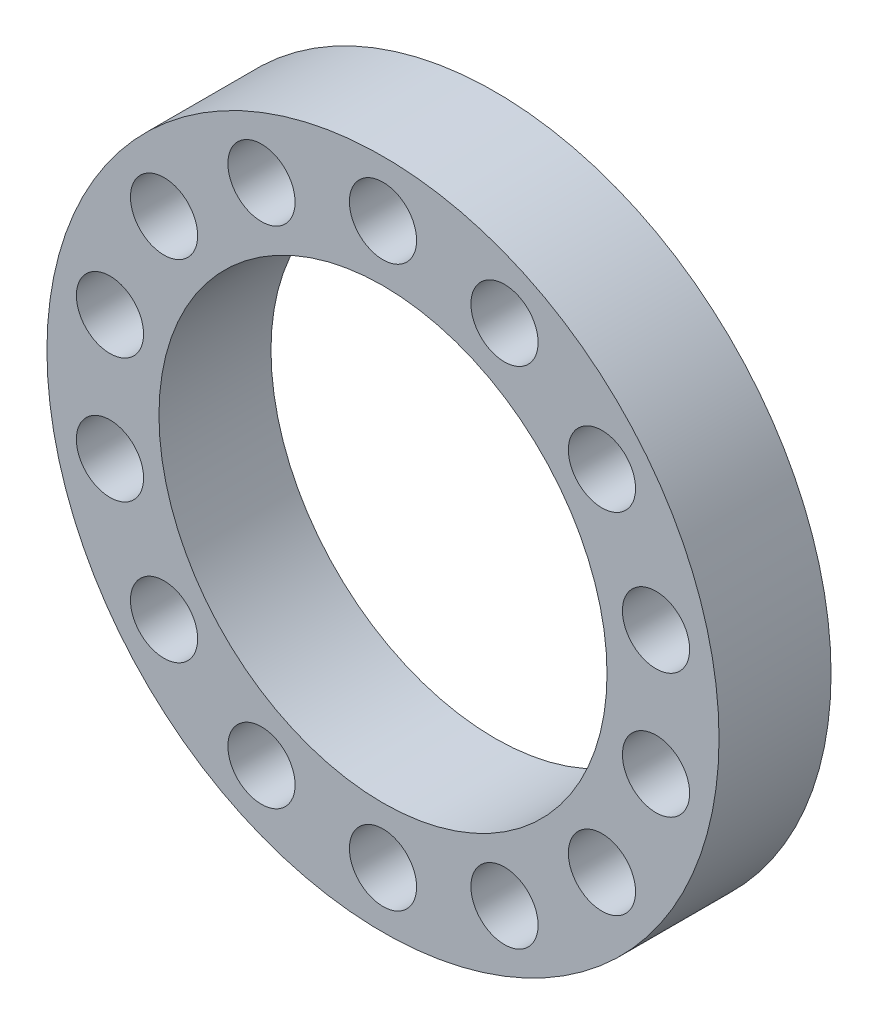
ISO-10303-21;
HEADER;
FILE_DESCRIPTION(('STEP AP214'),'2;1');
FILE_NAME('part.step','',(''),(''),'','','');
FILE_SCHEMA(('AUTOMOTIVE_DESIGN { 1 0 10303 214 1 1 1 1 }'));
ENDSEC;
DATA;
#1=APPLICATION_CONTEXT('core data for automotive mechanical design processes');
#2=APPLICATION_PROTOCOL_DEFINITION('international standard','automotive_design',2000,#1);
#3=PRODUCT_CONTEXT('',#1,'mechanical');
#4=PRODUCT('Part','Part','',(#3));
#5=PRODUCT_RELATED_PRODUCT_CATEGORY('part','',(#4));
#6=PRODUCT_DEFINITION_FORMATION('','',#4);
#7=PRODUCT_DEFINITION_CONTEXT('part definition',#1,'design');
#8=PRODUCT_DEFINITION('design','',#6,#7);
#9=PRODUCT_DEFINITION_SHAPE('','',#8);
#10=(LENGTH_UNIT() NAMED_UNIT(*) SI_UNIT(.MILLI.,.METRE.));
#11=(NAMED_UNIT(*) PLANE_ANGLE_UNIT() SI_UNIT($,.RADIAN.));
#12=(NAMED_UNIT(*) SI_UNIT($,.STERADIAN.) SOLID_ANGLE_UNIT());
#13=UNCERTAINTY_MEASURE_WITH_UNIT(LENGTH_MEASURE(1.E-05),#10,'distance_accuracy_value','');
#14=(GEOMETRIC_REPRESENTATION_CONTEXT(3) GLOBAL_UNCERTAINTY_ASSIGNED_CONTEXT((#13)) GLOBAL_UNIT_ASSIGNED_CONTEXT((#10,
#11,#12)) REPRESENTATION_CONTEXT('',''));
#15=CARTESIAN_POINT('',(0.,0.,0.));
#16=DIRECTION('',(0.,0.,1.));
#17=DIRECTION('',(1.,0.,0.));
#18=AXIS2_PLACEMENT_3D('',#15,#16,#17);
#19=CARTESIAN_POINT('',(0.,0.,50.));
#20=DIRECTION('',(0.,0.,1.));
#21=DIRECTION('',(1.,0.,0.));
#22=AXIS2_PLACEMENT_3D('',#19,#20,#21);
#23=PLANE('',#22);
#24=CARTESIAN_POINT('',(54.2354673896949,112.621108487802,50.));
#25=DIRECTION('',(0.,0.,1.));
#26=DIRECTION('',(1.,0.,0.));
#27=AXIS2_PLACEMENT_3D('',#24,#25,#26);
#28=CIRCLE('',#27,15.);
#29=CARTESIAN_POINT('',(69.2354673896949,112.621108487802,50.));
#30=VERTEX_POINT('',#29);
#31=EDGE_CURVE('E70',#30,#30,#28,.T.);
#32=ORIENTED_EDGE('',*,*,#31,.F.);
#33=EDGE_LOOP('',(#32));
#34=FACE_BOUND('',#33,.T.);
#35=CARTESIAN_POINT('',(97.7289353085039,77.9362252323415,50.));
#36=DIRECTION('',(0.,0.,1.));
#37=DIRECTION('',(1.,0.,0.));
#38=AXIS2_PLACEMENT_3D('',#35,#36,#37);
#39=CIRCLE('',#38,15.);
#40=CARTESIAN_POINT('',(112.728935308504,77.9362252323415,50.));
#41=VERTEX_POINT('',#40);
#42=EDGE_CURVE('E127',#41,#41,#39,.T.);
#43=ORIENTED_EDGE('',*,*,#42,.F.);
#44=EDGE_LOOP('',(#43));
#45=FACE_BOUND('',#44,.T.);
#46=CARTESIAN_POINT('',(121.865989022728,27.8151167445389,50.));
#47=DIRECTION('',(0.,0.,1.));
#48=DIRECTION('',(1.,0.,0.));
#49=AXIS2_PLACEMENT_3D('',#46,#47,#48);
#50=CIRCLE('',#49,15.);
#51=CARTESIAN_POINT('',(136.865989022728,27.8151167445389,50.));
#52=VERTEX_POINT('',#51);
#53=EDGE_CURVE('E119',#52,#52,#50,.T.);
#54=ORIENTED_EDGE('',*,*,#53,.F.);
#55=EDGE_LOOP('',(#54));
#56=FACE_BOUND('',#55,.T.);
#57=CARTESIAN_POINT('',(121.865989022728,-27.8151167445398,50.));
#58=DIRECTION('',(0.,0.,1.));
#59=DIRECTION('',(1.,0.,0.));
#60=AXIS2_PLACEMENT_3D('',#57,#58,#59);
#61=CIRCLE('',#60,15.);
#62=CARTESIAN_POINT('',(136.865989022728,-27.8151167445398,50.));
#63=VERTEX_POINT('',#62);
#64=EDGE_CURVE('E111',#63,#63,#61,.T.);
#65=ORIENTED_EDGE('',*,*,#64,.F.);
#66=EDGE_LOOP('',(#65));
#67=FACE_BOUND('',#66,.T.);
#68=CARTESIAN_POINT('',(97.7289353085034,-77.9362252323421,50.));
#69=DIRECTION('',(0.,0.,1.));
#70=DIRECTION('',(1.,0.,0.));
#71=AXIS2_PLACEMENT_3D('',#68,#69,#70);
#72=CIRCLE('',#71,15.);
#73=CARTESIAN_POINT('',(112.728935308503,-77.9362252323421,50.));
#74=VERTEX_POINT('',#73);
#75=EDGE_CURVE('E103',#74,#74,#72,.T.);
#76=ORIENTED_EDGE('',*,*,#75,.F.);
#77=EDGE_LOOP('',(#76));
#78=FACE_BOUND('',#77,.T.);
#79=CARTESIAN_POINT('',(54.2354673896941,-112.621108487803,50.));
#80=DIRECTION('',(0.,0.,1.));
#81=DIRECTION('',(1.,0.,0.));
#82=AXIS2_PLACEMENT_3D('',#79,#80,#81);
#83=CIRCLE('',#82,15.);
#84=CARTESIAN_POINT('',(69.2354673896941,-112.621108487803,50.));
#85=VERTEX_POINT('',#84);
#86=EDGE_CURVE('E95',#85,#85,#83,.T.);
#87=ORIENTED_EDGE('',*,*,#86,.F.);
#88=EDGE_LOOP('',(#87));
#89=FACE_BOUND('',#88,.T.);
#90=CARTESIAN_POINT('',(-8.72870334710783E-13,-125.,50.));
#91=DIRECTION('',(0.,0.,1.));
#92=DIRECTION('',(1.,0.,0.));
#93=AXIS2_PLACEMENT_3D('',#90,#91,#92);
#94=CIRCLE('',#93,15.);
#95=CARTESIAN_POINT('',(14.9999999999991,-125.,50.));
#96=VERTEX_POINT('',#95);
#97=EDGE_CURVE('E87',#96,#96,#94,.T.);
#98=ORIENTED_EDGE('',*,*,#97,.F.);
#99=EDGE_LOOP('',(#98));
#100=FACE_BOUND('',#99,.T.);
#101=CARTESIAN_POINT('',(-54.2354673896957,-112.621108487802,50.));
#102=DIRECTION('',(0.,0.,1.));
#103=DIRECTION('',(1.,0.,0.));
#104=AXIS2_PLACEMENT_3D('',#101,#102,#103);
#105=CIRCLE('',#104,15.);
#106=CARTESIAN_POINT('',(-39.2354673896957,-112.621108487802,50.));
#107=VERTEX_POINT('',#106);
#108=EDGE_CURVE('E78',#107,#107,#105,.T.);
#109=ORIENTED_EDGE('',*,*,#108,.F.);
#110=EDGE_LOOP('',(#109));
#111=FACE_BOUND('',#110,.T.);
#112=CARTESIAN_POINT('',(-97.7289353085044,-77.9362252323408,50.));
#113=DIRECTION('',(0.,0.,1.));
#114=DIRECTION('',(1.,0.,0.));
#115=AXIS2_PLACEMENT_3D('',#112,#113,#114);
#116=CIRCLE('',#115,15.);
#117=CARTESIAN_POINT('',(-82.7289353085044,-77.9362252323408,50.));
#118=VERTEX_POINT('',#117);
#119=EDGE_CURVE('E79',#118,#118,#116,.T.);
#120=ORIENTED_EDGE('',*,*,#119,.F.);
#121=EDGE_LOOP('',(#120));
#122=FACE_BOUND('',#121,.T.);
#123=CARTESIAN_POINT('',(-121.865989022728,-27.8151167445381,50.));
#124=DIRECTION('',(0.,0.,1.));
#125=DIRECTION('',(1.,0.,0.));
#126=AXIS2_PLACEMENT_3D('',#123,#124,#125);
#127=CIRCLE('',#126,15.);
#128=CARTESIAN_POINT('',(-106.865989022728,-27.8151167445381,50.));
#129=VERTEX_POINT('',#128);
#130=EDGE_CURVE('E167',#129,#129,#127,.T.);
#131=ORIENTED_EDGE('',*,*,#130,.F.);
#132=EDGE_LOOP('',(#131));
#133=FACE_BOUND('',#132,.T.);
#134=CARTESIAN_POINT('',(-121.865989022728,27.8151167445406,50.));
#135=DIRECTION('',(0.,0.,1.));
#136=DIRECTION('',(1.,0.,0.));
#137=AXIS2_PLACEMENT_3D('',#134,#135,#136);
#138=CIRCLE('',#137,15.);
#139=CARTESIAN_POINT('',(-106.865989022728,27.8151167445406,50.));
#140=VERTEX_POINT('',#139);
#141=EDGE_CURVE('E159',#140,#140,#138,.T.);
#142=ORIENTED_EDGE('',*,*,#141,.F.);
#143=EDGE_LOOP('',(#142));
#144=FACE_BOUND('',#143,.T.);
#145=CARTESIAN_POINT('',(-97.7289353085028,77.9362252323429,50.));
#146=DIRECTION('',(0.,0.,1.));
#147=DIRECTION('',(1.,0.,0.));
#148=AXIS2_PLACEMENT_3D('',#145,#146,#147);
#149=CIRCLE('',#148,15.);
#150=CARTESIAN_POINT('',(-82.7289353085028,77.9362252323429,50.));
#151=VERTEX_POINT('',#150);
#152=EDGE_CURVE('E151',#151,#151,#149,.T.);
#153=ORIENTED_EDGE('',*,*,#152,.F.);
#154=EDGE_LOOP('',(#153));
#155=FACE_BOUND('',#154,.T.);
#156=CARTESIAN_POINT('',(-54.2354673896933,112.621108487803,50.));
#157=DIRECTION('',(0.,0.,1.));
#158=DIRECTION('',(1.,0.,0.));
#159=AXIS2_PLACEMENT_3D('',#156,#157,#158);
#160=CIRCLE('',#159,15.);
#161=CARTESIAN_POINT('',(-39.2354673896933,112.621108487803,50.));
#162=VERTEX_POINT('',#161);
#163=EDGE_CURVE('E142',#162,#162,#160,.T.);
#164=ORIENTED_EDGE('',*,*,#163,.F.);
#165=EDGE_LOOP('',(#164));
#166=FACE_BOUND('',#165,.T.);
#167=CARTESIAN_POINT('',(0.,125.,50.));
#168=DIRECTION('',(0.,0.,1.));
#169=DIRECTION('',(1.,0.,0.));
#170=AXIS2_PLACEMENT_3D('',#167,#168,#169);
#171=CIRCLE('',#170,15.);
#172=CARTESIAN_POINT('',(15.,125.,50.));
#173=VERTEX_POINT('',#172);
#174=EDGE_CURVE('E66',#173,#173,#171,.T.);
#175=ORIENTED_EDGE('',*,*,#174,.F.);
#176=EDGE_LOOP('',(#175));
#177=FACE_BOUND('',#176,.T.);
#178=CARTESIAN_POINT('',(0.,0.,50.));
#179=DIRECTION('',(0.,0.,1.));
#180=DIRECTION('',(1.,0.,0.));
#181=AXIS2_PLACEMENT_3D('',#178,#179,#180);
#182=CIRCLE('',#181,150.);
#183=CARTESIAN_POINT('',(150.,0.,50.));
#184=VERTEX_POINT('',#183);
#185=EDGE_CURVE('E10',#184,#184,#182,.T.);
#186=ORIENTED_EDGE('',*,*,#185,.T.);
#187=EDGE_LOOP('',(#186));
#188=FACE_BOUND('',#187,.T.);
#189=CARTESIAN_POINT('',(0.,0.,50.));
#190=DIRECTION('',(0.,0.,1.));
#191=DIRECTION('',(1.,0.,0.));
#192=AXIS2_PLACEMENT_3D('',#189,#190,#191);
#193=CIRCLE('',#192,100.);
#194=CARTESIAN_POINT('',(100.,0.,50.));
#195=VERTEX_POINT('',#194);
#196=EDGE_CURVE('E56',#195,#195,#193,.T.);
#197=ORIENTED_EDGE('',*,*,#196,.F.);
#198=EDGE_LOOP('',(#197));
#199=FACE_BOUND('',#198,.T.);
#200=ADVANCED_FACE('F43',(#34,#45,#56,#67,#78,#89,#100,#111,#122,#133,#144,#155,#166,#177,#188,
#199),#23,.T.);
#201=CARTESIAN_POINT('',(0.,0.,0.));
#202=DIRECTION('',(0.,0.,1.));
#203=DIRECTION('',(1.,0.,0.));
#204=AXIS2_PLACEMENT_3D('',#201,#202,#203);
#205=PLANE('',#204);
#206=CARTESIAN_POINT('',(0.,125.,0.));
#207=DIRECTION('',(0.,0.,1.));
#208=DIRECTION('',(1.,0.,0.));
#209=AXIS2_PLACEMENT_3D('',#206,#207,#208);
#210=CIRCLE('',#209,6.);
#211=CARTESIAN_POINT('',(6.,125.,0.));
#212=VERTEX_POINT('',#211);
#213=EDGE_CURVE('E143',#212,#212,#210,.T.);
#214=ORIENTED_EDGE('',*,*,#213,.T.);
#215=EDGE_LOOP('',(#214));
#216=FACE_BOUND('',#215,.T.);
#217=CARTESIAN_POINT('',(-54.2354673896933,112.621108487803,0.));
#218=DIRECTION('',(0.,0.,1.));
#219=DIRECTION('',(1.,0.,0.));
#220=AXIS2_PLACEMENT_3D('',#217,#218,#219);
#221=CIRCLE('',#220,6.);
#222=CARTESIAN_POINT('',(-48.2354673896933,112.621108487803,0.));
#223=VERTEX_POINT('',#222);
#224=EDGE_CURVE('E244',#223,#223,#221,.T.);
#225=ORIENTED_EDGE('',*,*,#224,.T.);
#226=EDGE_LOOP('',(#225));
#227=FACE_BOUND('',#226,.T.);
#228=CARTESIAN_POINT('',(-97.7289353085028,77.9362252323429,0.));
#229=DIRECTION('',(0.,0.,1.));
#230=DIRECTION('',(1.,0.,0.));
#231=AXIS2_PLACEMENT_3D('',#228,#229,#230);
#232=CIRCLE('',#231,6.);
#233=CARTESIAN_POINT('',(-91.7289353085028,77.9362252323429,0.));
#234=VERTEX_POINT('',#233);
#235=EDGE_CURVE('E252',#234,#234,#232,.T.);
#236=ORIENTED_EDGE('',*,*,#235,.T.);
#237=EDGE_LOOP('',(#236));
#238=FACE_BOUND('',#237,.T.);
#239=CARTESIAN_POINT('',(-121.865989022728,27.8151167445406,0.));
#240=DIRECTION('',(0.,0.,1.));
#241=DIRECTION('',(1.,0.,0.));
#242=AXIS2_PLACEMENT_3D('',#239,#240,#241);
#243=CIRCLE('',#242,6.);
#244=CARTESIAN_POINT('',(-115.865989022728,27.8151167445406,0.));
#245=VERTEX_POINT('',#244);
#246=EDGE_CURVE('E260',#245,#245,#243,.T.);
#247=ORIENTED_EDGE('',*,*,#246,.T.);
#248=EDGE_LOOP('',(#247));
#249=FACE_BOUND('',#248,.T.);
#250=CARTESIAN_POINT('',(-121.865989022728,-27.8151167445381,0.));
#251=DIRECTION('',(0.,0.,1.));
#252=DIRECTION('',(1.,0.,0.));
#253=AXIS2_PLACEMENT_3D('',#250,#251,#252);
#254=CIRCLE('',#253,6.);
#255=CARTESIAN_POINT('',(-115.865989022728,-27.8151167445381,0.));
#256=VERTEX_POINT('',#255);
#257=EDGE_CURVE('E268',#256,#256,#254,.T.);
#258=ORIENTED_EDGE('',*,*,#257,.T.);
#259=EDGE_LOOP('',(#258));
#260=FACE_BOUND('',#259,.T.);
#261=CARTESIAN_POINT('',(-97.7289353085044,-77.9362252323408,0.));
#262=DIRECTION('',(0.,0.,1.));
#263=DIRECTION('',(1.,0.,0.));
#264=AXIS2_PLACEMENT_3D('',#261,#262,#263);
#265=CIRCLE('',#264,5.99999999999999);
#266=CARTESIAN_POINT('',(-91.7289353085044,-77.9362252323408,0.));
#267=VERTEX_POINT('',#266);
#268=EDGE_CURVE('E276',#267,#267,#265,.T.);
#269=ORIENTED_EDGE('',*,*,#268,.T.);
#270=EDGE_LOOP('',(#269));
#271=FACE_BOUND('',#270,.T.);
#272=CARTESIAN_POINT('',(-54.2354673896957,-112.621108487802,0.));
#273=DIRECTION('',(0.,0.,1.));
#274=DIRECTION('',(1.,0.,0.));
#275=AXIS2_PLACEMENT_3D('',#272,#273,#274);
#276=CIRCLE('',#275,6.00000000000001);
#277=CARTESIAN_POINT('',(-48.2354673896957,-112.621108487802,0.));
#278=VERTEX_POINT('',#277);
#279=EDGE_CURVE('E178',#278,#278,#276,.T.);
#280=ORIENTED_EDGE('',*,*,#279,.T.);
#281=EDGE_LOOP('',(#280));
#282=FACE_BOUND('',#281,.T.);
#283=CARTESIAN_POINT('',(-8.72870334710783E-13,-125.,0.));
#284=DIRECTION('',(0.,0.,1.));
#285=DIRECTION('',(1.,0.,0.));
#286=AXIS2_PLACEMENT_3D('',#283,#284,#285);
#287=CIRCLE('',#286,6.00000000000001);
#288=CARTESIAN_POINT('',(5.99999999999913,-125.,0.));
#289=VERTEX_POINT('',#288);
#290=EDGE_CURVE('E187',#289,#289,#287,.T.);
#291=ORIENTED_EDGE('',*,*,#290,.T.);
#292=EDGE_LOOP('',(#291));
#293=FACE_BOUND('',#292,.T.);
#294=CARTESIAN_POINT('',(54.2354673896941,-112.621108487803,0.));
#295=DIRECTION('',(0.,0.,1.));
#296=DIRECTION('',(1.,0.,0.));
#297=AXIS2_PLACEMENT_3D('',#294,#295,#296);
#298=CIRCLE('',#297,6.);
#299=CARTESIAN_POINT('',(60.2354673896941,-112.621108487803,0.));
#300=VERTEX_POINT('',#299);
#301=EDGE_CURVE('E195',#300,#300,#298,.T.);
#302=ORIENTED_EDGE('',*,*,#301,.T.);
#303=EDGE_LOOP('',(#302));
#304=FACE_BOUND('',#303,.T.);
#305=CARTESIAN_POINT('',(97.7289353085034,-77.9362252323421,0.));
#306=DIRECTION('',(0.,0.,1.));
#307=DIRECTION('',(1.,0.,0.));
#308=AXIS2_PLACEMENT_3D('',#305,#306,#307);
#309=CIRCLE('',#308,6.00000000000001);
#310=CARTESIAN_POINT('',(103.728935308503,-77.9362252323421,0.));
#311=VERTEX_POINT('',#310);
#312=EDGE_CURVE('E203',#311,#311,#309,.T.);
#313=ORIENTED_EDGE('',*,*,#312,.T.);
#314=EDGE_LOOP('',(#313));
#315=FACE_BOUND('',#314,.T.);
#316=CARTESIAN_POINT('',(121.865989022728,-27.8151167445398,0.));
#317=DIRECTION('',(0.,0.,1.));
#318=DIRECTION('',(1.,0.,0.));
#319=AXIS2_PLACEMENT_3D('',#316,#317,#318);
#320=CIRCLE('',#319,6.);
#321=CARTESIAN_POINT('',(127.865989022728,-27.8151167445398,0.));
#322=VERTEX_POINT('',#321);
#323=EDGE_CURVE('E211',#322,#322,#320,.T.);
#324=ORIENTED_EDGE('',*,*,#323,.T.);
#325=EDGE_LOOP('',(#324));
#326=FACE_BOUND('',#325,.T.);
#327=CARTESIAN_POINT('',(121.865989022728,27.8151167445389,0.));
#328=DIRECTION('',(0.,0.,1.));
#329=DIRECTION('',(1.,0.,0.));
#330=AXIS2_PLACEMENT_3D('',#327,#328,#329);
#331=CIRCLE('',#330,6.);
#332=CARTESIAN_POINT('',(127.865989022728,27.8151167445389,0.));
#333=VERTEX_POINT('',#332);
#334=EDGE_CURVE('E219',#333,#333,#331,.T.);
#335=ORIENTED_EDGE('',*,*,#334,.T.);
#336=EDGE_LOOP('',(#335));
#337=FACE_BOUND('',#336,.T.);
#338=CARTESIAN_POINT('',(97.7289353085039,77.9362252323415,0.));
#339=DIRECTION('',(0.,0.,1.));
#340=DIRECTION('',(1.,0.,0.));
#341=AXIS2_PLACEMENT_3D('',#338,#339,#340);
#342=CIRCLE('',#341,6.);
#343=CARTESIAN_POINT('',(103.728935308504,77.9362252323415,0.));
#344=VERTEX_POINT('',#343);
#345=EDGE_CURVE('E227',#344,#344,#342,.T.);
#346=ORIENTED_EDGE('',*,*,#345,.T.);
#347=EDGE_LOOP('',(#346));
#348=FACE_BOUND('',#347,.T.);
#349=CARTESIAN_POINT('',(54.2354673896949,112.621108487802,0.));
#350=DIRECTION('',(0.,0.,1.));
#351=DIRECTION('',(1.,0.,0.));
#352=AXIS2_PLACEMENT_3D('',#349,#350,#351);
#353=CIRCLE('',#352,6.);
#354=CARTESIAN_POINT('',(60.2354673896949,112.621108487802,0.));
#355=VERTEX_POINT('',#354);
#356=EDGE_CURVE('E235',#355,#355,#353,.T.);
#357=ORIENTED_EDGE('',*,*,#356,.T.);
#358=EDGE_LOOP('',(#357));
#359=FACE_BOUND('',#358,.T.);
#360=CARTESIAN_POINT('',(0.,0.,0.));
#361=DIRECTION('',(0.,0.,1.));
#362=DIRECTION('',(1.,0.,0.));
#363=AXIS2_PLACEMENT_3D('',#360,#361,#362);
#364=CIRCLE('',#363,150.);
#365=CARTESIAN_POINT('',(150.,0.,0.));
#366=VERTEX_POINT('',#365);
#367=EDGE_CURVE('E47',#366,#366,#364,.T.);
#368=ORIENTED_EDGE('',*,*,#367,.F.);
#369=EDGE_LOOP('',(#368));
#370=FACE_BOUND('',#369,.T.);
#371=CARTESIAN_POINT('',(0.,0.,0.));
#372=DIRECTION('',(0.,0.,1.));
#373=DIRECTION('',(1.,0.,0.));
#374=AXIS2_PLACEMENT_3D('',#371,#372,#373);
#375=CIRCLE('',#374,100.);
#376=CARTESIAN_POINT('',(100.,0.,0.));
#377=VERTEX_POINT('',#376);
#378=EDGE_CURVE('E58',#377,#377,#375,.T.);
#379=ORIENTED_EDGE('',*,*,#378,.T.);
#380=EDGE_LOOP('',(#379));
#381=FACE_BOUND('',#380,.T.);
#382=ADVANCED_FACE('F290',(#216,#227,#238,#249,#260,#271,#282,#293,#304,#315,#326,#337,#348,
#359,#370,#381),#205,.F.);
#383=CARTESIAN_POINT('',(0.,0.,50.));
#384=DIRECTION('',(0.,0.,-1.));
#385=DIRECTION('',(-1.,0.,0.));
#386=AXIS2_PLACEMENT_3D('',#383,#384,#385);
#387=CYLINDRICAL_SURFACE('',#386,150.);
#388=ORIENTED_EDGE('',*,*,#185,.F.);
#389=EDGE_LOOP('',(#388));
#390=FACE_BOUND('',#389,.T.);
#391=ORIENTED_EDGE('',*,*,#367,.T.);
#392=EDGE_LOOP('',(#391));
#393=FACE_BOUND('',#392,.T.);
#394=ADVANCED_FACE('F45',(#390,#393),#387,.T.);
#395=CARTESIAN_POINT('',(0.,0.,50.));
#396=DIRECTION('',(0.,0.,-1.));
#397=DIRECTION('',(-1.,0.,0.));
#398=AXIS2_PLACEMENT_3D('',#395,#396,#397);
#399=CYLINDRICAL_SURFACE('',#398,100.);
#400=ORIENTED_EDGE('',*,*,#196,.T.);
#401=EDGE_LOOP('',(#400));
#402=FACE_BOUND('',#401,.T.);
#403=ORIENTED_EDGE('',*,*,#378,.F.);
#404=EDGE_LOOP('',(#403));
#405=FACE_BOUND('',#404,.T.);
#406=ADVANCED_FACE('F310',(#402,#405),#399,.F.);
#407=CARTESIAN_POINT('',(0.,125.,10.));
#408=DIRECTION('',(0.,0.,1.));
#409=DIRECTION('',(1.,0.,0.));
#410=AXIS2_PLACEMENT_3D('',#407,#408,#409);
#411=CYLINDRICAL_SURFACE('',#410,15.);
#412=CARTESIAN_POINT('',(0.,125.,10.));
#413=DIRECTION('',(0.,0.,1.));
#414=DIRECTION('',(1.,0.,0.));
#415=AXIS2_PLACEMENT_3D('',#412,#413,#414);
#416=CIRCLE('',#415,15.);
#417=CARTESIAN_POINT('',(15.,125.,10.));
#418=VERTEX_POINT('',#417);
#419=EDGE_CURVE('E62',#418,#418,#416,.T.);
#420=ORIENTED_EDGE('',*,*,#419,.F.);
#421=EDGE_LOOP('',(#420));
#422=FACE_BOUND('',#421,.T.);
#423=ORIENTED_EDGE('',*,*,#174,.T.);
#424=EDGE_LOOP('',(#423));
#425=FACE_BOUND('',#424,.T.);
#426=ADVANCED_FACE('F304',(#422,#425),#411,.F.);
#427=CARTESIAN_POINT('',(0.,125.,10.));
#428=DIRECTION('',(0.,0.,1.));
#429=DIRECTION('',(1.,0.,0.));
#430=AXIS2_PLACEMENT_3D('',#427,#428,#429);
#431=PLANE('',#430);
#432=CARTESIAN_POINT('',(0.,125.,10.));
#433=DIRECTION('',(0.,0.,1.));
#434=DIRECTION('',(1.,0.,0.));
#435=AXIS2_PLACEMENT_3D('',#432,#433,#434);
#436=CIRCLE('',#435,6.);
#437=CARTESIAN_POINT('',(6.,125.,10.));
#438=VERTEX_POINT('',#437);
#439=EDGE_CURVE('E243',#438,#438,#436,.T.);
#440=ORIENTED_EDGE('',*,*,#439,.F.);
#441=EDGE_LOOP('',(#440));
#442=FACE_BOUND('',#441,.T.);
#443=ORIENTED_EDGE('',*,*,#419,.T.);
#444=EDGE_LOOP('',(#443));
#445=FACE_BOUND('',#444,.T.);
#446=ADVANCED_FACE('F300',(#442,#445),#431,.T.);
#447=CARTESIAN_POINT('',(-54.2354673896933,112.621108487803,10.));
#448=DIRECTION('',(0.,0.,1.));
#449=DIRECTION('',(1.,0.,0.));
#450=AXIS2_PLACEMENT_3D('',#447,#448,#449);
#451=CYLINDRICAL_SURFACE('',#450,15.);
#452=CARTESIAN_POINT('',(-54.2354673896933,112.621108487803,10.));
#453=DIRECTION('',(0.,0.,1.));
#454=DIRECTION('',(1.,0.,0.));
#455=AXIS2_PLACEMENT_3D('',#452,#453,#454);
#456=CIRCLE('',#455,15.);
#457=CARTESIAN_POINT('',(-39.2354673896933,112.621108487803,10.));
#458=VERTEX_POINT('',#457);
#459=EDGE_CURVE('E138',#458,#458,#456,.T.);
#460=ORIENTED_EDGE('',*,*,#459,.F.);
#461=EDGE_LOOP('',(#460));
#462=FACE_BOUND('',#461,.T.);
#463=ORIENTED_EDGE('',*,*,#163,.T.);
#464=EDGE_LOOP('',(#463));
#465=FACE_BOUND('',#464,.T.);
#466=ADVANCED_FACE('F303',(#462,#465),#451,.F.);
#467=CARTESIAN_POINT('',(-54.2354673896933,112.621108487803,10.));
#468=DIRECTION('',(0.,0.,1.));
#469=DIRECTION('',(1.,0.,0.));
#470=AXIS2_PLACEMENT_3D('',#467,#468,#469);
#471=PLANE('',#470);
#472=CARTESIAN_POINT('',(-54.2354673896933,112.621108487803,10.));
#473=DIRECTION('',(0.,0.,1.));
#474=DIRECTION('',(1.,0.,0.));
#475=AXIS2_PLACEMENT_3D('',#472,#473,#474);
#476=CIRCLE('',#475,6.);
#477=CARTESIAN_POINT('',(-48.2354673896933,112.621108487803,10.));
#478=VERTEX_POINT('',#477);
#479=EDGE_CURVE('E248',#478,#478,#476,.T.);
#480=ORIENTED_EDGE('',*,*,#479,.F.);
#481=EDGE_LOOP('',(#480));
#482=FACE_BOUND('',#481,.T.);
#483=ORIENTED_EDGE('',*,*,#459,.T.);
#484=EDGE_LOOP('',(#483));
#485=FACE_BOUND('',#484,.T.);
#486=ADVANCED_FACE('F397',(#482,#485),#471,.T.);
#487=CARTESIAN_POINT('',(-97.7289353085028,77.9362252323429,10.));
#488=DIRECTION('',(0.,0.,1.));
#489=DIRECTION('',(1.,0.,0.));
#490=AXIS2_PLACEMENT_3D('',#487,#488,#489);
#491=CYLINDRICAL_SURFACE('',#490,15.);
#492=CARTESIAN_POINT('',(-97.7289353085028,77.9362252323429,10.));
#493=DIRECTION('',(0.,0.,1.));
#494=DIRECTION('',(1.,0.,0.));
#495=AXIS2_PLACEMENT_3D('',#492,#493,#494);
#496=CIRCLE('',#495,15.);
#497=CARTESIAN_POINT('',(-82.7289353085028,77.9362252323429,10.));
#498=VERTEX_POINT('',#497);
#499=EDGE_CURVE('E147',#498,#498,#496,.T.);
#500=ORIENTED_EDGE('',*,*,#499,.F.);
#501=EDGE_LOOP('',(#500));
#502=FACE_BOUND('',#501,.T.);
#503=ORIENTED_EDGE('',*,*,#152,.T.);
#504=EDGE_LOOP('',(#503));
#505=FACE_BOUND('',#504,.T.);
#506=ADVANCED_FACE('F400',(#502,#505),#491,.F.);
#507=CARTESIAN_POINT('',(-97.7289353085028,77.9362252323429,10.));
#508=DIRECTION('',(0.,0.,1.));
#509=DIRECTION('',(1.,0.,0.));
#510=AXIS2_PLACEMENT_3D('',#507,#508,#509);
#511=PLANE('',#510);
#512=CARTESIAN_POINT('',(-97.7289353085028,77.9362252323429,10.));
#513=DIRECTION('',(0.,0.,1.));
#514=DIRECTION('',(1.,0.,0.));
#515=AXIS2_PLACEMENT_3D('',#512,#513,#514);
#516=CIRCLE('',#515,6.);
#517=CARTESIAN_POINT('',(-91.7289353085028,77.9362252323429,10.));
#518=VERTEX_POINT('',#517);
#519=EDGE_CURVE('E256',#518,#518,#516,.T.);
#520=ORIENTED_EDGE('',*,*,#519,.F.);
#521=EDGE_LOOP('',(#520));
#522=FACE_BOUND('',#521,.T.);
#523=ORIENTED_EDGE('',*,*,#499,.T.);
#524=EDGE_LOOP('',(#523));
#525=FACE_BOUND('',#524,.T.);
#526=ADVANCED_FACE('F405',(#522,#525),#511,.T.);
#527=CARTESIAN_POINT('',(-121.865989022728,27.8151167445406,10.));
#528=DIRECTION('',(0.,0.,1.));
#529=DIRECTION('',(1.,0.,0.));
#530=AXIS2_PLACEMENT_3D('',#527,#528,#529);
#531=CYLINDRICAL_SURFACE('',#530,15.);
#532=CARTESIAN_POINT('',(-121.865989022728,27.8151167445406,10.));
#533=DIRECTION('',(0.,0.,1.));
#534=DIRECTION('',(1.,0.,0.));
#535=AXIS2_PLACEMENT_3D('',#532,#533,#534);
#536=CIRCLE('',#535,15.);
#537=CARTESIAN_POINT('',(-106.865989022728,27.8151167445406,10.));
#538=VERTEX_POINT('',#537);
#539=EDGE_CURVE('E155',#538,#538,#536,.T.);
#540=ORIENTED_EDGE('',*,*,#539,.F.);
#541=EDGE_LOOP('',(#540));
#542=FACE_BOUND('',#541,.T.);
#543=ORIENTED_EDGE('',*,*,#141,.T.);
#544=EDGE_LOOP('',(#543));
#545=FACE_BOUND('',#544,.T.);
#546=ADVANCED_FACE('F408',(#542,#545),#531,.F.);
#547=CARTESIAN_POINT('',(-121.865989022728,27.8151167445406,10.));
#548=DIRECTION('',(0.,0.,1.));
#549=DIRECTION('',(1.,0.,0.));
#550=AXIS2_PLACEMENT_3D('',#547,#548,#549);
#551=PLANE('',#550);
#552=CARTESIAN_POINT('',(-121.865989022728,27.8151167445406,10.));
#553=DIRECTION('',(0.,0.,1.));
#554=DIRECTION('',(1.,0.,0.));
#555=AXIS2_PLACEMENT_3D('',#552,#553,#554);
#556=CIRCLE('',#555,6.);
#557=CARTESIAN_POINT('',(-115.865989022728,27.8151167445406,10.));
#558=VERTEX_POINT('',#557);
#559=EDGE_CURVE('E264',#558,#558,#556,.T.);
#560=ORIENTED_EDGE('',*,*,#559,.F.);
#561=EDGE_LOOP('',(#560));
#562=FACE_BOUND('',#561,.T.);
#563=ORIENTED_EDGE('',*,*,#539,.T.);
#564=EDGE_LOOP('',(#563));
#565=FACE_BOUND('',#564,.T.);
#566=ADVANCED_FACE('F413',(#562,#565),#551,.T.);
#567=CARTESIAN_POINT('',(-121.865989022728,-27.8151167445381,10.));
#568=DIRECTION('',(0.,0.,1.));
#569=DIRECTION('',(1.,0.,0.));
#570=AXIS2_PLACEMENT_3D('',#567,#568,#569);
#571=CYLINDRICAL_SURFACE('',#570,15.);
#572=CARTESIAN_POINT('',(-121.865989022728,-27.8151167445381,10.));
#573=DIRECTION('',(0.,0.,1.));
#574=DIRECTION('',(1.,0.,0.));
#575=AXIS2_PLACEMENT_3D('',#572,#573,#574);
#576=CIRCLE('',#575,15.);
#577=CARTESIAN_POINT('',(-106.865989022728,-27.8151167445381,10.));
#578=VERTEX_POINT('',#577);
#579=EDGE_CURVE('E163',#578,#578,#576,.T.);
#580=ORIENTED_EDGE('',*,*,#579,.F.);
#581=EDGE_LOOP('',(#580));
#582=FACE_BOUND('',#581,.T.);
#583=ORIENTED_EDGE('',*,*,#130,.T.);
#584=EDGE_LOOP('',(#583));
#585=FACE_BOUND('',#584,.T.);
#586=ADVANCED_FACE('F416',(#582,#585),#571,.F.);
#587=CARTESIAN_POINT('',(-121.865989022728,-27.8151167445381,10.));
#588=DIRECTION('',(0.,0.,1.));
#589=DIRECTION('',(1.,0.,0.));
#590=AXIS2_PLACEMENT_3D('',#587,#588,#589);
#591=PLANE('',#590);
#592=CARTESIAN_POINT('',(-121.865989022728,-27.8151167445381,10.));
#593=DIRECTION('',(0.,0.,1.));
#594=DIRECTION('',(1.,0.,0.));
#595=AXIS2_PLACEMENT_3D('',#592,#593,#594);
#596=CIRCLE('',#595,6.);
#597=CARTESIAN_POINT('',(-115.865989022728,-27.8151167445381,10.));
#598=VERTEX_POINT('',#597);
#599=EDGE_CURVE('E272',#598,#598,#596,.T.);
#600=ORIENTED_EDGE('',*,*,#599,.F.);
#601=EDGE_LOOP('',(#600));
#602=FACE_BOUND('',#601,.T.);
#603=ORIENTED_EDGE('',*,*,#579,.T.);
#604=EDGE_LOOP('',(#603));
#605=FACE_BOUND('',#604,.T.);
#606=ADVANCED_FACE('F421',(#602,#605),#591,.T.);
#607=CARTESIAN_POINT('',(-97.7289353085044,-77.9362252323408,10.));
#608=DIRECTION('',(0.,0.,1.));
#609=DIRECTION('',(1.,0.,0.));
#610=AXIS2_PLACEMENT_3D('',#607,#608,#609);
#611=CYLINDRICAL_SURFACE('',#610,15.);
#612=CARTESIAN_POINT('',(-97.7289353085044,-77.9362252323408,10.));
#613=DIRECTION('',(0.,0.,1.));
#614=DIRECTION('',(1.,0.,0.));
#615=AXIS2_PLACEMENT_3D('',#612,#613,#614);
#616=CIRCLE('',#615,15.);
#617=CARTESIAN_POINT('',(-82.7289353085044,-77.9362252323408,10.));
#618=VERTEX_POINT('',#617);
#619=EDGE_CURVE('E171',#618,#618,#616,.T.);
#620=ORIENTED_EDGE('',*,*,#619,.F.);
#621=EDGE_LOOP('',(#620));
#622=FACE_BOUND('',#621,.T.);
#623=ORIENTED_EDGE('',*,*,#119,.T.);
#624=EDGE_LOOP('',(#623));
#625=FACE_BOUND('',#624,.T.);
#626=ADVANCED_FACE('F424',(#622,#625),#611,.F.);
#627=CARTESIAN_POINT('',(-97.7289353085044,-77.9362252323408,10.));
#628=DIRECTION('',(0.,0.,1.));
#629=DIRECTION('',(1.,0.,0.));
#630=AXIS2_PLACEMENT_3D('',#627,#628,#629);
#631=PLANE('',#630);
#632=CARTESIAN_POINT('',(-97.7289353085044,-77.9362252323408,10.));
#633=DIRECTION('',(0.,0.,1.));
#634=DIRECTION('',(1.,0.,0.));
#635=AXIS2_PLACEMENT_3D('',#632,#633,#634);
#636=CIRCLE('',#635,5.99999999999999);
#637=CARTESIAN_POINT('',(-91.7289353085044,-77.9362252323408,10.));
#638=VERTEX_POINT('',#637);
#639=EDGE_CURVE('E183',#638,#638,#636,.T.);
#640=ORIENTED_EDGE('',*,*,#639,.F.);
#641=EDGE_LOOP('',(#640));
#642=FACE_BOUND('',#641,.T.);
#643=ORIENTED_EDGE('',*,*,#619,.T.);
#644=EDGE_LOOP('',(#643));
#645=FACE_BOUND('',#644,.T.);
#646=ADVANCED_FACE('F340',(#642,#645),#631,.T.);
#647=CARTESIAN_POINT('',(-54.2354673896957,-112.621108487802,10.));
#648=DIRECTION('',(0.,0.,1.));
#649=DIRECTION('',(1.,0.,0.));
#650=AXIS2_PLACEMENT_3D('',#647,#648,#649);
#651=CYLINDRICAL_SURFACE('',#650,15.);
#652=CARTESIAN_POINT('',(-54.2354673896957,-112.621108487802,10.));
#653=DIRECTION('',(0.,0.,1.));
#654=DIRECTION('',(1.,0.,0.));
#655=AXIS2_PLACEMENT_3D('',#652,#653,#654);
#656=CIRCLE('',#655,15.);
#657=CARTESIAN_POINT('',(-39.2354673896957,-112.621108487802,10.));
#658=VERTEX_POINT('',#657);
#659=EDGE_CURVE('E74',#658,#658,#656,.T.);
#660=ORIENTED_EDGE('',*,*,#659,.F.);
#661=EDGE_LOOP('',(#660));
#662=FACE_BOUND('',#661,.T.);
#663=ORIENTED_EDGE('',*,*,#108,.T.);
#664=EDGE_LOOP('',(#663));
#665=FACE_BOUND('',#664,.T.);
#666=ADVANCED_FACE('F336',(#662,#665),#651,.F.);
#667=CARTESIAN_POINT('',(-54.2354673896957,-112.621108487802,10.));
#668=DIRECTION('',(0.,0.,1.));
#669=DIRECTION('',(1.,0.,0.));
#670=AXIS2_PLACEMENT_3D('',#667,#668,#669);
#671=PLANE('',#670);
#672=CARTESIAN_POINT('',(-54.2354673896957,-112.621108487802,10.));
#673=DIRECTION('',(0.,0.,1.));
#674=DIRECTION('',(1.,0.,0.));
#675=AXIS2_PLACEMENT_3D('',#672,#673,#674);
#676=CIRCLE('',#675,6.00000000000001);
#677=CARTESIAN_POINT('',(-48.2354673896957,-112.621108487802,10.));
#678=VERTEX_POINT('',#677);
#679=EDGE_CURVE('E182',#678,#678,#676,.T.);
#680=ORIENTED_EDGE('',*,*,#679,.F.);
#681=EDGE_LOOP('',(#680));
#682=FACE_BOUND('',#681,.T.);
#683=ORIENTED_EDGE('',*,*,#659,.T.);
#684=EDGE_LOOP('',(#683));
#685=FACE_BOUND('',#684,.T.);
#686=ADVANCED_FACE('F332',(#682,#685),#671,.T.);
#687=CARTESIAN_POINT('',(-8.72870334710783E-13,-125.,10.));
#688=DIRECTION('',(0.,0.,1.));
#689=DIRECTION('',(1.,0.,0.));
#690=AXIS2_PLACEMENT_3D('',#687,#688,#689);
#691=CYLINDRICAL_SURFACE('',#690,15.);
#692=CARTESIAN_POINT('',(-8.72870334710783E-13,-125.,10.));
#693=DIRECTION('',(0.,0.,1.));
#694=DIRECTION('',(1.,0.,0.));
#695=AXIS2_PLACEMENT_3D('',#692,#693,#694);
#696=CIRCLE('',#695,15.);
#697=CARTESIAN_POINT('',(14.9999999999991,-125.,10.));
#698=VERTEX_POINT('',#697);
#699=EDGE_CURVE('E83',#698,#698,#696,.T.);
#700=ORIENTED_EDGE('',*,*,#699,.F.);
#701=EDGE_LOOP('',(#700));
#702=FACE_BOUND('',#701,.T.);
#703=ORIENTED_EDGE('',*,*,#97,.T.);
#704=EDGE_LOOP('',(#703));
#705=FACE_BOUND('',#704,.T.);
#706=ADVANCED_FACE('F335',(#702,#705),#691,.F.);
#707=CARTESIAN_POINT('',(-8.72870334710783E-13,-125.,10.));
#708=DIRECTION('',(0.,0.,1.));
#709=DIRECTION('',(1.,0.,0.));
#710=AXIS2_PLACEMENT_3D('',#707,#708,#709);
#711=PLANE('',#710);
#712=CARTESIAN_POINT('',(-8.72870334710783E-13,-125.,10.));
#713=DIRECTION('',(0.,0.,1.));
#714=DIRECTION('',(1.,0.,0.));
#715=AXIS2_PLACEMENT_3D('',#712,#713,#714);
#716=CIRCLE('',#715,6.00000000000001);
#717=CARTESIAN_POINT('',(5.99999999999913,-125.,10.));
#718=VERTEX_POINT('',#717);
#719=EDGE_CURVE('E191',#718,#718,#716,.T.);
#720=ORIENTED_EDGE('',*,*,#719,.F.);
#721=EDGE_LOOP('',(#720));
#722=FACE_BOUND('',#721,.T.);
#723=ORIENTED_EDGE('',*,*,#699,.T.);
#724=EDGE_LOOP('',(#723));
#725=FACE_BOUND('',#724,.T.);
#726=ADVANCED_FACE('F342',(#722,#725),#711,.T.);
#727=CARTESIAN_POINT('',(54.2354673896941,-112.621108487803,10.));
#728=DIRECTION('',(0.,0.,1.));
#729=DIRECTION('',(1.,0.,0.));
#730=AXIS2_PLACEMENT_3D('',#727,#728,#729);
#731=CYLINDRICAL_SURFACE('',#730,15.);
#732=CARTESIAN_POINT('',(54.2354673896941,-112.621108487803,10.));
#733=DIRECTION('',(0.,0.,1.));
#734=DIRECTION('',(1.,0.,0.));
#735=AXIS2_PLACEMENT_3D('',#732,#733,#734);
#736=CIRCLE('',#735,15.);
#737=CARTESIAN_POINT('',(69.2354673896941,-112.621108487803,10.));
#738=VERTEX_POINT('',#737);
#739=EDGE_CURVE('E91',#738,#738,#736,.T.);
#740=ORIENTED_EDGE('',*,*,#739,.F.);
#741=EDGE_LOOP('',(#740));
#742=FACE_BOUND('',#741,.T.);
#743=ORIENTED_EDGE('',*,*,#86,.T.);
#744=EDGE_LOOP('',(#743));
#745=FACE_BOUND('',#744,.T.);
#746=ADVANCED_FACE('F345',(#742,#745),#731,.F.);
#747=CARTESIAN_POINT('',(54.2354673896941,-112.621108487803,10.));
#748=DIRECTION('',(0.,0.,1.));
#749=DIRECTION('',(1.,0.,0.));
#750=AXIS2_PLACEMENT_3D('',#747,#748,#749);
#751=PLANE('',#750);
#752=CARTESIAN_POINT('',(54.2354673896941,-112.621108487803,10.));
#753=DIRECTION('',(0.,0.,1.));
#754=DIRECTION('',(1.,0.,0.));
#755=AXIS2_PLACEMENT_3D('',#752,#753,#754);
#756=CIRCLE('',#755,6.);
#757=CARTESIAN_POINT('',(60.2354673896941,-112.621108487803,10.));
#758=VERTEX_POINT('',#757);
#759=EDGE_CURVE('E199',#758,#758,#756,.T.);
#760=ORIENTED_EDGE('',*,*,#759,.F.);
#761=EDGE_LOOP('',(#760));
#762=FACE_BOUND('',#761,.T.);
#763=ORIENTED_EDGE('',*,*,#739,.T.);
#764=EDGE_LOOP('',(#763));
#765=FACE_BOUND('',#764,.T.);
#766=ADVANCED_FACE('F350',(#762,#765),#751,.T.);
#767=CARTESIAN_POINT('',(97.7289353085034,-77.9362252323421,10.));
#768=DIRECTION('',(0.,0.,1.));
#769=DIRECTION('',(1.,0.,0.));
#770=AXIS2_PLACEMENT_3D('',#767,#768,#769);
#771=CYLINDRICAL_SURFACE('',#770,15.);
#772=CARTESIAN_POINT('',(97.7289353085034,-77.9362252323421,10.));
#773=DIRECTION('',(0.,0.,1.));
#774=DIRECTION('',(1.,0.,0.));
#775=AXIS2_PLACEMENT_3D('',#772,#773,#774);
#776=CIRCLE('',#775,15.);
#777=CARTESIAN_POINT('',(112.728935308503,-77.9362252323421,10.));
#778=VERTEX_POINT('',#777);
#779=EDGE_CURVE('E99',#778,#778,#776,.T.);
#780=ORIENTED_EDGE('',*,*,#779,.F.);
#781=EDGE_LOOP('',(#780));
#782=FACE_BOUND('',#781,.T.);
#783=ORIENTED_EDGE('',*,*,#75,.T.);
#784=EDGE_LOOP('',(#783));
#785=FACE_BOUND('',#784,.T.);
#786=ADVANCED_FACE('F353',(#782,#785),#771,.F.);
#787=CARTESIAN_POINT('',(97.7289353085034,-77.9362252323421,10.));
#788=DIRECTION('',(0.,0.,1.));
#789=DIRECTION('',(1.,0.,0.));
#790=AXIS2_PLACEMENT_3D('',#787,#788,#789);
#791=PLANE('',#790);
#792=CARTESIAN_POINT('',(97.7289353085034,-77.9362252323421,10.));
#793=DIRECTION('',(0.,0.,1.));
#794=DIRECTION('',(1.,0.,0.));
#795=AXIS2_PLACEMENT_3D('',#792,#793,#794);
#796=CIRCLE('',#795,6.00000000000001);
#797=CARTESIAN_POINT('',(103.728935308503,-77.9362252323421,10.));
#798=VERTEX_POINT('',#797);
#799=EDGE_CURVE('E207',#798,#798,#796,.T.);
#800=ORIENTED_EDGE('',*,*,#799,.F.);
#801=EDGE_LOOP('',(#800));
#802=FACE_BOUND('',#801,.T.);
#803=ORIENTED_EDGE('',*,*,#779,.T.);
#804=EDGE_LOOP('',(#803));
#805=FACE_BOUND('',#804,.T.);
#806=ADVANCED_FACE('F358',(#802,#805),#791,.T.);
#807=CARTESIAN_POINT('',(121.865989022728,-27.8151167445398,10.));
#808=DIRECTION('',(0.,0.,1.));
#809=DIRECTION('',(1.,0.,0.));
#810=AXIS2_PLACEMENT_3D('',#807,#808,#809);
#811=CYLINDRICAL_SURFACE('',#810,15.);
#812=CARTESIAN_POINT('',(121.865989022728,-27.8151167445398,10.));
#813=DIRECTION('',(0.,0.,1.));
#814=DIRECTION('',(1.,0.,0.));
#815=AXIS2_PLACEMENT_3D('',#812,#813,#814);
#816=CIRCLE('',#815,15.);
#817=CARTESIAN_POINT('',(136.865989022728,-27.8151167445398,10.));
#818=VERTEX_POINT('',#817);
#819=EDGE_CURVE('E107',#818,#818,#816,.T.);
#820=ORIENTED_EDGE('',*,*,#819,.F.);
#821=EDGE_LOOP('',(#820));
#822=FACE_BOUND('',#821,.T.);
#823=ORIENTED_EDGE('',*,*,#64,.T.);
#824=EDGE_LOOP('',(#823));
#825=FACE_BOUND('',#824,.T.);
#826=ADVANCED_FACE('F361',(#822,#825),#811,.F.);
#827=CARTESIAN_POINT('',(121.865989022728,-27.8151167445398,10.));
#828=DIRECTION('',(0.,0.,1.));
#829=DIRECTION('',(1.,0.,0.));
#830=AXIS2_PLACEMENT_3D('',#827,#828,#829);
#831=PLANE('',#830);
#832=CARTESIAN_POINT('',(121.865989022728,-27.8151167445398,10.));
#833=DIRECTION('',(0.,0.,1.));
#834=DIRECTION('',(1.,0.,0.));
#835=AXIS2_PLACEMENT_3D('',#832,#833,#834);
#836=CIRCLE('',#835,6.);
#837=CARTESIAN_POINT('',(127.865989022728,-27.8151167445398,10.));
#838=VERTEX_POINT('',#837);
#839=EDGE_CURVE('E215',#838,#838,#836,.T.);
#840=ORIENTED_EDGE('',*,*,#839,.F.);
#841=EDGE_LOOP('',(#840));
#842=FACE_BOUND('',#841,.T.);
#843=ORIENTED_EDGE('',*,*,#819,.T.);
#844=EDGE_LOOP('',(#843));
#845=FACE_BOUND('',#844,.T.);
#846=ADVANCED_FACE('F366',(#842,#845),#831,.T.);
#847=CARTESIAN_POINT('',(121.865989022728,27.8151167445389,10.));
#848=DIRECTION('',(0.,0.,1.));
#849=DIRECTION('',(1.,0.,0.));
#850=AXIS2_PLACEMENT_3D('',#847,#848,#849);
#851=CYLINDRICAL_SURFACE('',#850,15.);
#852=CARTESIAN_POINT('',(121.865989022728,27.8151167445389,10.));
#853=DIRECTION('',(0.,0.,1.));
#854=DIRECTION('',(1.,0.,0.));
#855=AXIS2_PLACEMENT_3D('',#852,#853,#854);
#856=CIRCLE('',#855,15.);
#857=CARTESIAN_POINT('',(136.865989022728,27.8151167445389,10.));
#858=VERTEX_POINT('',#857);
#859=EDGE_CURVE('E115',#858,#858,#856,.T.);
#860=ORIENTED_EDGE('',*,*,#859,.F.);
#861=EDGE_LOOP('',(#860));
#862=FACE_BOUND('',#861,.T.);
#863=ORIENTED_EDGE('',*,*,#53,.T.);
#864=EDGE_LOOP('',(#863));
#865=FACE_BOUND('',#864,.T.);
#866=ADVANCED_FACE('F369',(#862,#865),#851,.F.);
#867=CARTESIAN_POINT('',(121.865989022728,27.8151167445389,10.));
#868=DIRECTION('',(0.,0.,1.));
#869=DIRECTION('',(1.,0.,0.));
#870=AXIS2_PLACEMENT_3D('',#867,#868,#869);
#871=PLANE('',#870);
#872=CARTESIAN_POINT('',(121.865989022728,27.8151167445389,10.));
#873=DIRECTION('',(0.,0.,1.));
#874=DIRECTION('',(1.,0.,0.));
#875=AXIS2_PLACEMENT_3D('',#872,#873,#874);
#876=CIRCLE('',#875,6.);
#877=CARTESIAN_POINT('',(127.865989022728,27.8151167445389,10.));
#878=VERTEX_POINT('',#877);
#879=EDGE_CURVE('E223',#878,#878,#876,.T.);
#880=ORIENTED_EDGE('',*,*,#879,.F.);
#881=EDGE_LOOP('',(#880));
#882=FACE_BOUND('',#881,.T.);
#883=ORIENTED_EDGE('',*,*,#859,.T.);
#884=EDGE_LOOP('',(#883));
#885=FACE_BOUND('',#884,.T.);
#886=ADVANCED_FACE('F374',(#882,#885),#871,.T.);
#887=CARTESIAN_POINT('',(97.7289353085039,77.9362252323415,10.));
#888=DIRECTION('',(0.,0.,1.));
#889=DIRECTION('',(1.,0.,0.));
#890=AXIS2_PLACEMENT_3D('',#887,#888,#889);
#891=CYLINDRICAL_SURFACE('',#890,15.);
#892=CARTESIAN_POINT('',(97.7289353085039,77.9362252323415,10.));
#893=DIRECTION('',(0.,0.,1.));
#894=DIRECTION('',(1.,0.,0.));
#895=AXIS2_PLACEMENT_3D('',#892,#893,#894);
#896=CIRCLE('',#895,15.);
#897=CARTESIAN_POINT('',(112.728935308504,77.9362252323415,10.));
#898=VERTEX_POINT('',#897);
#899=EDGE_CURVE('E123',#898,#898,#896,.T.);
#900=ORIENTED_EDGE('',*,*,#899,.F.);
#901=EDGE_LOOP('',(#900));
#902=FACE_BOUND('',#901,.T.);
#903=ORIENTED_EDGE('',*,*,#42,.T.);
#904=EDGE_LOOP('',(#903));
#905=FACE_BOUND('',#904,.T.);
#906=ADVANCED_FACE('F377',(#902,#905),#891,.F.);
#907=CARTESIAN_POINT('',(97.7289353085039,77.9362252323415,10.));
#908=DIRECTION('',(0.,0.,1.));
#909=DIRECTION('',(1.,0.,0.));
#910=AXIS2_PLACEMENT_3D('',#907,#908,#909);
#911=PLANE('',#910);
#912=CARTESIAN_POINT('',(97.7289353085039,77.9362252323415,10.));
#913=DIRECTION('',(0.,0.,1.));
#914=DIRECTION('',(1.,0.,0.));
#915=AXIS2_PLACEMENT_3D('',#912,#913,#914);
#916=CIRCLE('',#915,6.);
#917=CARTESIAN_POINT('',(103.728935308504,77.9362252323415,10.));
#918=VERTEX_POINT('',#917);
#919=EDGE_CURVE('E231',#918,#918,#916,.T.);
#920=ORIENTED_EDGE('',*,*,#919,.F.);
#921=EDGE_LOOP('',(#920));
#922=FACE_BOUND('',#921,.T.);
#923=ORIENTED_EDGE('',*,*,#899,.T.);
#924=EDGE_LOOP('',(#923));
#925=FACE_BOUND('',#924,.T.);
#926=ADVANCED_FACE('F382',(#922,#925),#911,.T.);
#927=CARTESIAN_POINT('',(54.2354673896949,112.621108487802,10.));
#928=DIRECTION('',(0.,0.,1.));
#929=DIRECTION('',(1.,0.,0.));
#930=AXIS2_PLACEMENT_3D('',#927,#928,#929);
#931=CYLINDRICAL_SURFACE('',#930,15.);
#932=CARTESIAN_POINT('',(54.2354673896949,112.621108487802,10.));
#933=DIRECTION('',(0.,0.,1.));
#934=DIRECTION('',(1.,0.,0.));
#935=AXIS2_PLACEMENT_3D('',#932,#933,#934);
#936=CIRCLE('',#935,15.);
#937=CARTESIAN_POINT('',(69.2354673896949,112.621108487802,10.));
#938=VERTEX_POINT('',#937);
#939=EDGE_CURVE('E131',#938,#938,#936,.T.);
#940=ORIENTED_EDGE('',*,*,#939,.F.);
#941=EDGE_LOOP('',(#940));
#942=FACE_BOUND('',#941,.T.);
#943=ORIENTED_EDGE('',*,*,#31,.T.);
#944=EDGE_LOOP('',(#943));
#945=FACE_BOUND('',#944,.T.);
#946=ADVANCED_FACE('F385',(#942,#945),#931,.F.);
#947=CARTESIAN_POINT('',(54.2354673896949,112.621108487802,10.));
#948=DIRECTION('',(0.,0.,1.));
#949=DIRECTION('',(1.,0.,0.));
#950=AXIS2_PLACEMENT_3D('',#947,#948,#949);
#951=PLANE('',#950);
#952=CARTESIAN_POINT('',(54.2354673896949,112.621108487802,10.));
#953=DIRECTION('',(0.,0.,1.));
#954=DIRECTION('',(1.,0.,0.));
#955=AXIS2_PLACEMENT_3D('',#952,#953,#954);
#956=CIRCLE('',#955,6.);
#957=CARTESIAN_POINT('',(60.2354673896949,112.621108487802,10.));
#958=VERTEX_POINT('',#957);
#959=EDGE_CURVE('E239',#958,#958,#956,.T.);
#960=ORIENTED_EDGE('',*,*,#959,.F.);
#961=EDGE_LOOP('',(#960));
#962=FACE_BOUND('',#961,.T.);
#963=ORIENTED_EDGE('',*,*,#939,.T.);
#964=EDGE_LOOP('',(#963));
#965=FACE_BOUND('',#964,.T.);
#966=ADVANCED_FACE('F390',(#962,#965),#951,.T.);
#967=CARTESIAN_POINT('',(54.2354673896949,112.621108487802,0.));
#968=DIRECTION('',(0.,0.,1.));
#969=DIRECTION('',(1.,0.,0.));
#970=AXIS2_PLACEMENT_3D('',#967,#968,#969);
#971=CYLINDRICAL_SURFACE('',#970,6.);
#972=ORIENTED_EDGE('',*,*,#356,.F.);
#973=EDGE_LOOP('',(#972));
#974=FACE_BOUND('',#973,.T.);
#975=ORIENTED_EDGE('',*,*,#959,.T.);
#976=EDGE_LOOP('',(#975));
#977=FACE_BOUND('',#976,.T.);
#978=ADVANCED_FACE('F393',(#974,#977),#971,.F.);
#979=CARTESIAN_POINT('',(97.7289353085039,77.9362252323415,0.));
#980=DIRECTION('',(0.,0.,1.));
#981=DIRECTION('',(1.,0.,0.));
#982=AXIS2_PLACEMENT_3D('',#979,#980,#981);
#983=CYLINDRICAL_SURFACE('',#982,6.);
#984=ORIENTED_EDGE('',*,*,#345,.F.);
#985=EDGE_LOOP('',(#984));
#986=FACE_BOUND('',#985,.T.);
#987=ORIENTED_EDGE('',*,*,#919,.T.);
#988=EDGE_LOOP('',(#987));
#989=FACE_BOUND('',#988,.T.);
#990=ADVANCED_FACE('F459',(#986,#989),#983,.F.);
#991=CARTESIAN_POINT('',(121.865989022728,27.8151167445389,0.));
#992=DIRECTION('',(0.,0.,1.));
#993=DIRECTION('',(1.,0.,0.));
#994=AXIS2_PLACEMENT_3D('',#991,#992,#993);
#995=CYLINDRICAL_SURFACE('',#994,6.);
#996=ORIENTED_EDGE('',*,*,#334,.F.);
#997=EDGE_LOOP('',(#996));
#998=FACE_BOUND('',#997,.T.);
#999=ORIENTED_EDGE('',*,*,#879,.T.);
#1000=EDGE_LOOP('',(#999));
#1001=FACE_BOUND('',#1000,.T.);
#1002=ADVANCED_FACE('F455',(#998,#1001),#995,.F.);
#1003=CARTESIAN_POINT('',(121.865989022728,-27.8151167445398,0.));
#1004=DIRECTION('',(0.,0.,1.));
#1005=DIRECTION('',(1.,0.,0.));
#1006=AXIS2_PLACEMENT_3D('',#1003,#1004,#1005);
#1007=CYLINDRICAL_SURFACE('',#1006,6.);
#1008=ORIENTED_EDGE('',*,*,#323,.F.);
#1009=EDGE_LOOP('',(#1008));
#1010=FACE_BOUND('',#1009,.T.);
#1011=ORIENTED_EDGE('',*,*,#839,.T.);
#1012=EDGE_LOOP('',(#1011));
#1013=FACE_BOUND('',#1012,.T.);
#1014=ADVANCED_FACE('F451',(#1010,#1013),#1007,.F.);
#1015=CARTESIAN_POINT('',(97.7289353085034,-77.9362252323421,0.));
#1016=DIRECTION('',(0.,0.,1.));
#1017=DIRECTION('',(1.,0.,0.));
#1018=AXIS2_PLACEMENT_3D('',#1015,#1016,#1017);
#1019=CYLINDRICAL_SURFACE('',#1018,6.00000000000001);
#1020=ORIENTED_EDGE('',*,*,#312,.F.);
#1021=EDGE_LOOP('',(#1020));
#1022=FACE_BOUND('',#1021,.T.);
#1023=ORIENTED_EDGE('',*,*,#799,.T.);
#1024=EDGE_LOOP('',(#1023));
#1025=FACE_BOUND('',#1024,.T.);
#1026=ADVANCED_FACE('F447',(#1022,#1025),#1019,.F.);
#1027=CARTESIAN_POINT('',(54.2354673896941,-112.621108487803,0.));
#1028=DIRECTION('',(0.,0.,1.));
#1029=DIRECTION('',(1.,0.,0.));
#1030=AXIS2_PLACEMENT_3D('',#1027,#1028,#1029);
#1031=CYLINDRICAL_SURFACE('',#1030,6.);
#1032=ORIENTED_EDGE('',*,*,#301,.F.);
#1033=EDGE_LOOP('',(#1032));
#1034=FACE_BOUND('',#1033,.T.);
#1035=ORIENTED_EDGE('',*,*,#759,.T.);
#1036=EDGE_LOOP('',(#1035));
#1037=FACE_BOUND('',#1036,.T.);
#1038=ADVANCED_FACE('F443',(#1034,#1037),#1031,.F.);
#1039=CARTESIAN_POINT('',(-8.72870334710783E-13,-125.,0.));
#1040=DIRECTION('',(0.,0.,1.));
#1041=DIRECTION('',(1.,0.,0.));
#1042=AXIS2_PLACEMENT_3D('',#1039,#1040,#1041);
#1043=CYLINDRICAL_SURFACE('',#1042,6.00000000000001);
#1044=ORIENTED_EDGE('',*,*,#290,.F.);
#1045=EDGE_LOOP('',(#1044));
#1046=FACE_BOUND('',#1045,.T.);
#1047=ORIENTED_EDGE('',*,*,#719,.T.);
#1048=EDGE_LOOP('',(#1047));
#1049=FACE_BOUND('',#1048,.T.);
#1050=ADVANCED_FACE('F439',(#1046,#1049),#1043,.F.);
#1051=CARTESIAN_POINT('',(-54.2354673896957,-112.621108487802,0.));
#1052=DIRECTION('',(0.,0.,1.));
#1053=DIRECTION('',(1.,0.,0.));
#1054=AXIS2_PLACEMENT_3D('',#1051,#1052,#1053);
#1055=CYLINDRICAL_SURFACE('',#1054,6.00000000000001);
#1056=ORIENTED_EDGE('',*,*,#279,.F.);
#1057=EDGE_LOOP('',(#1056));
#1058=FACE_BOUND('',#1057,.T.);
#1059=ORIENTED_EDGE('',*,*,#679,.T.);
#1060=EDGE_LOOP('',(#1059));
#1061=FACE_BOUND('',#1060,.T.);
#1062=ADVANCED_FACE('F435',(#1058,#1061),#1055,.F.);
#1063=CARTESIAN_POINT('',(-97.7289353085044,-77.9362252323408,0.));
#1064=DIRECTION('',(0.,0.,1.));
#1065=DIRECTION('',(1.,0.,0.));
#1066=AXIS2_PLACEMENT_3D('',#1063,#1064,#1065);
#1067=CYLINDRICAL_SURFACE('',#1066,5.99999999999999);
#1068=ORIENTED_EDGE('',*,*,#268,.F.);
#1069=EDGE_LOOP('',(#1068));
#1070=FACE_BOUND('',#1069,.T.);
#1071=ORIENTED_EDGE('',*,*,#639,.T.);
#1072=EDGE_LOOP('',(#1071));
#1073=FACE_BOUND('',#1072,.T.);
#1074=ADVANCED_FACE('F438',(#1070,#1073),#1067,.F.);
#1075=CARTESIAN_POINT('',(-121.865989022728,-27.8151167445381,0.));
#1076=DIRECTION('',(0.,0.,1.));
#1077=DIRECTION('',(1.,0.,0.));
#1078=AXIS2_PLACEMENT_3D('',#1075,#1076,#1077);
#1079=CYLINDRICAL_SURFACE('',#1078,6.);
#1080=ORIENTED_EDGE('',*,*,#257,.F.);
#1081=EDGE_LOOP('',(#1080));
#1082=FACE_BOUND('',#1081,.T.);
#1083=ORIENTED_EDGE('',*,*,#599,.T.);
#1084=EDGE_LOOP('',(#1083));
#1085=FACE_BOUND('',#1084,.T.);
#1086=ADVANCED_FACE('F477',(#1082,#1085),#1079,.F.);
#1087=CARTESIAN_POINT('',(-121.865989022728,27.8151167445406,0.));
#1088=DIRECTION('',(0.,0.,1.));
#1089=DIRECTION('',(1.,0.,0.));
#1090=AXIS2_PLACEMENT_3D('',#1087,#1088,#1089);
#1091=CYLINDRICAL_SURFACE('',#1090,6.);
#1092=ORIENTED_EDGE('',*,*,#246,.F.);
#1093=EDGE_LOOP('',(#1092));
#1094=FACE_BOUND('',#1093,.T.);
#1095=ORIENTED_EDGE('',*,*,#559,.T.);
#1096=EDGE_LOOP('',(#1095));
#1097=FACE_BOUND('',#1096,.T.);
#1098=ADVANCED_FACE('F473',(#1094,#1097),#1091,.F.);
#1099=CARTESIAN_POINT('',(-97.7289353085028,77.9362252323429,0.));
#1100=DIRECTION('',(0.,0.,1.));
#1101=DIRECTION('',(1.,0.,0.));
#1102=AXIS2_PLACEMENT_3D('',#1099,#1100,#1101);
#1103=CYLINDRICAL_SURFACE('',#1102,6.);
#1104=ORIENTED_EDGE('',*,*,#235,.F.);
#1105=EDGE_LOOP('',(#1104));
#1106=FACE_BOUND('',#1105,.T.);
#1107=ORIENTED_EDGE('',*,*,#519,.T.);
#1108=EDGE_LOOP('',(#1107));
#1109=FACE_BOUND('',#1108,.T.);
#1110=ADVANCED_FACE('F469',(#1106,#1109),#1103,.F.);
#1111=CARTESIAN_POINT('',(-54.2354673896933,112.621108487803,0.));
#1112=DIRECTION('',(0.,0.,1.));
#1113=DIRECTION('',(1.,0.,0.));
#1114=AXIS2_PLACEMENT_3D('',#1111,#1112,#1113);
#1115=CYLINDRICAL_SURFACE('',#1114,6.);
#1116=ORIENTED_EDGE('',*,*,#224,.F.);
#1117=EDGE_LOOP('',(#1116));
#1118=FACE_BOUND('',#1117,.T.);
#1119=ORIENTED_EDGE('',*,*,#479,.T.);
#1120=EDGE_LOOP('',(#1119));
#1121=FACE_BOUND('',#1120,.T.);
#1122=ADVANCED_FACE('F296',(#1118,#1121),#1115,.F.);
#1123=CARTESIAN_POINT('',(0.,125.,0.));
#1124=DIRECTION('',(0.,0.,1.));
#1125=DIRECTION('',(1.,0.,0.));
#1126=AXIS2_PLACEMENT_3D('',#1123,#1124,#1125);
#1127=CYLINDRICAL_SURFACE('',#1126,6.);
#1128=ORIENTED_EDGE('',*,*,#213,.F.);
#1129=EDGE_LOOP('',(#1128));
#1130=FACE_BOUND('',#1129,.T.);
#1131=ORIENTED_EDGE('',*,*,#439,.T.);
#1132=EDGE_LOOP('',(#1131));
#1133=FACE_BOUND('',#1132,.T.);
#1134=ADVANCED_FACE('F293',(#1130,#1133),#1127,.F.);
#1135=CLOSED_SHELL('',(#200,#382,#394,#406,#426,#446,#466,#486,#506,#526,#546,#566,#586,#606,
#626,#646,#666,#686,#706,#726,#746,#766,#786,#806,#826,#846,#866,#886,#906,#926,#946,#966,#978,
#990,#1002,#1014,#1026,#1038,#1050,#1062,#1074,#1086,#1098,#1110,#1122,#1134));
#1136=MANIFOLD_SOLID_BREP('B2',#1135);
#1137=ADVANCED_BREP_SHAPE_REPRESENTATION('',(#18,#1136),#14);
#1138=SHAPE_DEFINITION_REPRESENTATION(#9,#1137);
ENDSEC;
END-ISO-10303-21;
